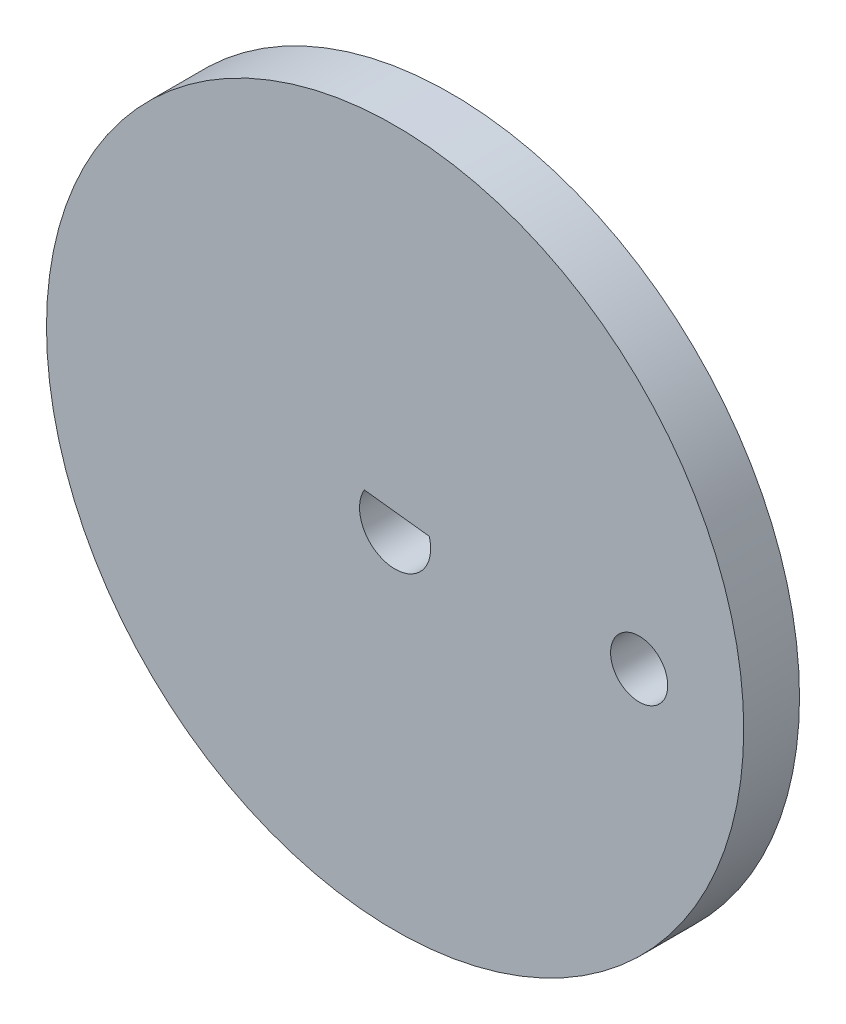
ISO-10303-21;
HEADER;
FILE_DESCRIPTION(('STEP AP214'),'2;1');
FILE_NAME('part.step','',(''),(''),'','','');
FILE_SCHEMA(('AUTOMOTIVE_DESIGN { 1 0 10303 214 1 1 1 1 }'));
ENDSEC;
DATA;
#1=APPLICATION_CONTEXT('core data for automotive mechanical design processes');
#2=APPLICATION_PROTOCOL_DEFINITION('international standard','automotive_design',2000,#1);
#3=PRODUCT_CONTEXT('',#1,'mechanical');
#4=PRODUCT('Part','Part','',(#3));
#5=PRODUCT_RELATED_PRODUCT_CATEGORY('part','',(#4));
#6=PRODUCT_DEFINITION_FORMATION('','',#4);
#7=PRODUCT_DEFINITION_CONTEXT('part definition',#1,'design');
#8=PRODUCT_DEFINITION('design','',#6,#7);
#9=PRODUCT_DEFINITION_SHAPE('','',#8);
#10=(LENGTH_UNIT() NAMED_UNIT(*) SI_UNIT(.MILLI.,.METRE.));
#11=(NAMED_UNIT(*) PLANE_ANGLE_UNIT() SI_UNIT($,.RADIAN.));
#12=(NAMED_UNIT(*) SI_UNIT($,.STERADIAN.) SOLID_ANGLE_UNIT());
#13=UNCERTAINTY_MEASURE_WITH_UNIT(LENGTH_MEASURE(1.E-05),#10,'distance_accuracy_value','');
#14=(GEOMETRIC_REPRESENTATION_CONTEXT(3) GLOBAL_UNCERTAINTY_ASSIGNED_CONTEXT((#13)) GLOBAL_UNIT_ASSIGNED_CONTEXT((#10,
#11,#12)) REPRESENTATION_CONTEXT('',''));
#15=CARTESIAN_POINT('',(0.,0.,0.));
#16=DIRECTION('',(0.,0.,1.));
#17=DIRECTION('',(1.,0.,0.));
#18=AXIS2_PLACEMENT_3D('',#15,#16,#17);
#19=CARTESIAN_POINT('',(0.,0.,8.));
#20=DIRECTION('',(0.,0.,1.));
#21=DIRECTION('',(1.,0.,0.));
#22=AXIS2_PLACEMENT_3D('',#19,#20,#21);
#23=PLANE('',#22);
#24=DIRECTION('',(-0.993068456954926,0.117537397457839,0.));
#25=VECTOR('',#24,1.);
#26=CARTESIAN_POINT('',(4.89403723026289,1.43471237145316,8.));
#27=LINE('',#26,#25);
#28=CARTESIAN_POINT('',(4.89403723026289,1.43471237145316,8.));
#29=VERTEX_POINT('',#28);
#30=CARTESIAN_POINT('',(-4.42388764043153,2.53756145636655,8.));
#31=VERTEX_POINT('',#30);
#32=EDGE_CURVE('E87',#29,#31,#27,.T.);
#33=ORIENTED_EDGE('',*,*,#32,.F.);
#34=CARTESIAN_POINT('',(0.,0.,8.));
#35=DIRECTION('',(0.,0.,1.));
#36=DIRECTION('',(1.,0.,0.));
#37=AXIS2_PLACEMENT_3D('',#34,#35,#36);
#38=CIRCLE('',#37,5.1);
#39=EDGE_CURVE('E73',#31,#29,#38,.T.);
#40=ORIENTED_EDGE('',*,*,#39,.F.);
#41=EDGE_LOOP('',(#33,#40));
#42=FACE_BOUND('',#41,.T.);
#43=CARTESIAN_POINT('',(0.,0.,8.));
#44=DIRECTION('',(0.,0.,1.));
#45=DIRECTION('',(1.,0.,0.));
#46=AXIS2_PLACEMENT_3D('',#43,#44,#45);
#47=CIRCLE('',#46,50.);
#48=CARTESIAN_POINT('',(50.,0.,8.));
#49=VERTEX_POINT('',#48);
#50=EDGE_CURVE('E11',#49,#49,#47,.T.);
#51=ORIENTED_EDGE('',*,*,#50,.T.);
#52=EDGE_LOOP('',(#51));
#53=FACE_BOUND('',#52,.T.);
#54=CARTESIAN_POINT('',(35.,0.,8.));
#55=DIRECTION('',(0.,0.,1.));
#56=DIRECTION('',(1.,0.,0.));
#57=AXIS2_PLACEMENT_3D('',#54,#55,#56);
#58=CIRCLE('',#57,4.1);
#59=CARTESIAN_POINT('',(39.1,0.,8.));
#60=VERTEX_POINT('',#59);
#61=EDGE_CURVE('E81',#60,#60,#58,.T.);
#62=ORIENTED_EDGE('',*,*,#61,.F.);
#63=EDGE_LOOP('',(#62));
#64=FACE_BOUND('',#63,.T.);
#65=ADVANCED_FACE('F41',(#42,#53,#64),#23,.T.);
#66=CARTESIAN_POINT('',(0.,0.,0.));
#67=DIRECTION('',(0.,0.,1.));
#68=DIRECTION('',(1.,0.,0.));
#69=AXIS2_PLACEMENT_3D('',#66,#67,#68);
#70=PLANE('',#69);
#71=CARTESIAN_POINT('',(0.,0.,0.));
#72=DIRECTION('',(0.,0.,1.));
#73=DIRECTION('',(1.,0.,0.));
#74=AXIS2_PLACEMENT_3D('',#71,#72,#73);
#75=CIRCLE('',#74,50.);
#76=CARTESIAN_POINT('',(50.,0.,0.));
#77=VERTEX_POINT('',#76);
#78=EDGE_CURVE('E45',#77,#77,#75,.T.);
#79=ORIENTED_EDGE('',*,*,#78,.F.);
#80=EDGE_LOOP('',(#79));
#81=FACE_BOUND('',#80,.T.);
#82=CARTESIAN_POINT('',(0.,0.,0.));
#83=DIRECTION('',(0.,0.,1.));
#84=DIRECTION('',(1.,0.,0.));
#85=AXIS2_PLACEMENT_3D('',#82,#83,#84);
#86=CIRCLE('',#85,5.1);
#87=CARTESIAN_POINT('',(-4.42388764043153,2.53756145636655,0.));
#88=VERTEX_POINT('',#87);
#89=CARTESIAN_POINT('',(4.89403723026289,1.43471237145316,0.));
#90=VERTEX_POINT('',#89);
#91=EDGE_CURVE('E63',#88,#90,#86,.T.);
#92=ORIENTED_EDGE('',*,*,#91,.T.);
#93=DIRECTION('',(-0.993068456954926,0.117537397457839,0.));
#94=VECTOR('',#93,1.);
#95=CARTESIAN_POINT('',(4.89403723026289,1.43471237145316,0.));
#96=LINE('',#95,#94);
#97=EDGE_CURVE('E69',#90,#88,#96,.T.);
#98=ORIENTED_EDGE('',*,*,#97,.T.);
#99=EDGE_LOOP('',(#92,#98));
#100=FACE_BOUND('',#99,.T.);
#101=CARTESIAN_POINT('',(35.,0.,0.));
#102=DIRECTION('',(0.,0.,1.));
#103=DIRECTION('',(1.,0.,0.));
#104=AXIS2_PLACEMENT_3D('',#101,#102,#103);
#105=CIRCLE('',#104,4.1);
#106=CARTESIAN_POINT('',(39.1,0.,0.));
#107=VERTEX_POINT('',#106);
#108=EDGE_CURVE('E84',#107,#107,#105,.T.);
#109=ORIENTED_EDGE('',*,*,#108,.T.);
#110=EDGE_LOOP('',(#109));
#111=FACE_BOUND('',#110,.T.);
#112=ADVANCED_FACE('F79',(#81,#100,#111),#70,.F.);
#113=CARTESIAN_POINT('',(0.,0.,8.));
#114=DIRECTION('',(0.,0.,-1.));
#115=DIRECTION('',(-1.,0.,0.));
#116=AXIS2_PLACEMENT_3D('',#113,#114,#115);
#117=CYLINDRICAL_SURFACE('',#116,50.);
#118=ORIENTED_EDGE('',*,*,#50,.F.);
#119=EDGE_LOOP('',(#118));
#120=FACE_BOUND('',#119,.T.);
#121=ORIENTED_EDGE('',*,*,#78,.T.);
#122=EDGE_LOOP('',(#121));
#123=FACE_BOUND('',#122,.T.);
#124=ADVANCED_FACE('F43',(#120,#123),#117,.T.);
#125=CARTESIAN_POINT('',(0.,0.,8.));
#126=DIRECTION('',(0.,0.,-1.));
#127=DIRECTION('',(-1.,0.,0.));
#128=AXIS2_PLACEMENT_3D('',#125,#126,#127);
#129=CYLINDRICAL_SURFACE('',#128,5.1);
#130=ORIENTED_EDGE('',*,*,#91,.F.);
#131=DIRECTION('',(0.,0.,-1.));
#132=VECTOR('',#131,1.);
#133=CARTESIAN_POINT('',(-4.42388764043153,2.53756145636655,8.));
#134=LINE('',#133,#132);
#135=EDGE_CURVE('E71',#31,#88,#134,.T.);
#136=ORIENTED_EDGE('',*,*,#135,.F.);
#137=ORIENTED_EDGE('',*,*,#39,.T.);
#138=DIRECTION('',(0.,0.,-1.));
#139=VECTOR('',#138,1.);
#140=CARTESIAN_POINT('',(4.89403723026289,1.43471237145316,8.));
#141=LINE('',#140,#139);
#142=EDGE_CURVE('E56',#29,#90,#141,.T.);
#143=ORIENTED_EDGE('',*,*,#142,.T.);
#144=EDGE_LOOP('',(#130,#136,#137,#143));
#145=FACE_BOUND('',#144,.T.);
#146=ADVANCED_FACE('F75',(#145),#129,.F.);
#147=CARTESIAN_POINT('',(4.89403723026289,1.43471237145316,8.));
#148=DIRECTION('',(-0.117537397457839,-0.993068456954926,0.));
#149=DIRECTION('',(0.993068456954926,-0.117537397457839,0.));
#150=AXIS2_PLACEMENT_3D('',#147,#148,#149);
#151=PLANE('',#150);
#152=ORIENTED_EDGE('',*,*,#97,.F.);
#153=ORIENTED_EDGE('',*,*,#142,.F.);
#154=ORIENTED_EDGE('',*,*,#32,.T.);
#155=ORIENTED_EDGE('',*,*,#135,.T.);
#156=EDGE_LOOP('',(#152,#153,#154,#155));
#157=FACE_BOUND('',#156,.T.);
#158=ADVANCED_FACE('F70',(#157),#151,.T.);
#159=CARTESIAN_POINT('',(35.,0.,8.));
#160=DIRECTION('',(0.,0.,-1.));
#161=DIRECTION('',(-1.,0.,0.));
#162=AXIS2_PLACEMENT_3D('',#159,#160,#161);
#163=CYLINDRICAL_SURFACE('',#162,4.1);
#164=ORIENTED_EDGE('',*,*,#61,.T.);
#165=EDGE_LOOP('',(#164));
#166=FACE_BOUND('',#165,.T.);
#167=ORIENTED_EDGE('',*,*,#108,.F.);
#168=EDGE_LOOP('',(#167));
#169=FACE_BOUND('',#168,.T.);
#170=ADVANCED_FACE('F94',(#166,#169),#163,.F.);
#171=CLOSED_SHELL('',(#65,#112,#124,#146,#158,#170));
#172=MANIFOLD_SOLID_BREP('B2',#171);
#173=ADVANCED_BREP_SHAPE_REPRESENTATION('',(#18,#172),#14);
#174=SHAPE_DEFINITION_REPRESENTATION(#9,#173);
ENDSEC;
END-ISO-10303-21;
